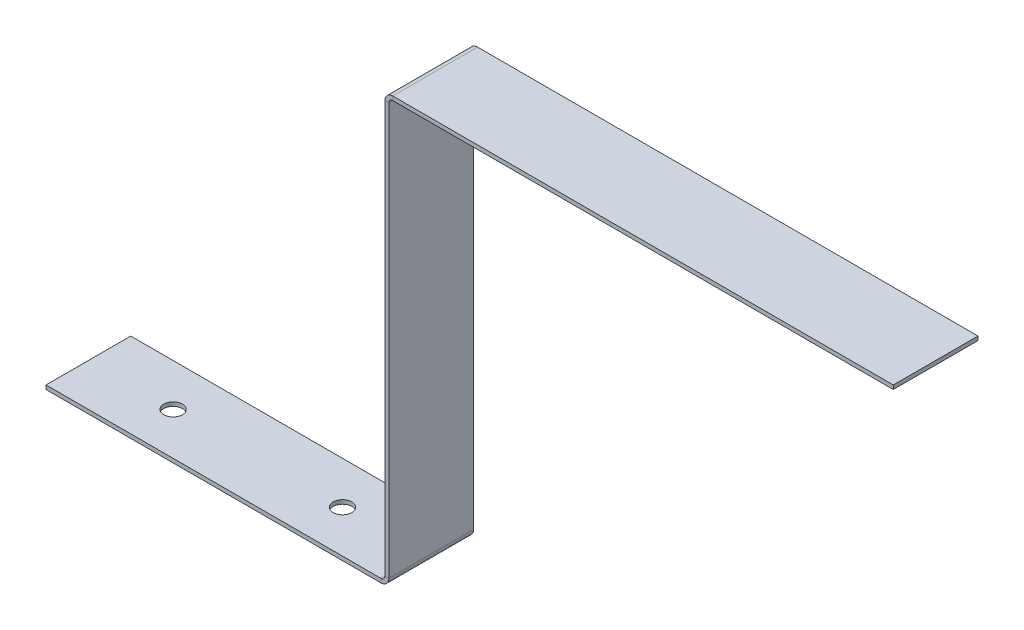
ISO-10303-21;
HEADER;
FILE_DESCRIPTION(('STEP AP214'),'2;1');
FILE_NAME('part.step','',(''),(''),'','','');
FILE_SCHEMA(('AUTOMOTIVE_DESIGN { 1 0 10303 214 1 1 1 1 }'));
ENDSEC;
DATA;
#1=APPLICATION_CONTEXT('core data for automotive mechanical design processes');
#2=APPLICATION_PROTOCOL_DEFINITION('international standard','automotive_design',2000,#1);
#3=PRODUCT_CONTEXT('',#1,'mechanical');
#4=PRODUCT('Part','Part','',(#3));
#5=PRODUCT_RELATED_PRODUCT_CATEGORY('part','',(#4));
#6=PRODUCT_DEFINITION_FORMATION('','',#4);
#7=PRODUCT_DEFINITION_CONTEXT('part definition',#1,'design');
#8=PRODUCT_DEFINITION('design','',#6,#7);
#9=PRODUCT_DEFINITION_SHAPE('','',#8);
#10=(LENGTH_UNIT() NAMED_UNIT(*) SI_UNIT(.MILLI.,.METRE.));
#11=(NAMED_UNIT(*) PLANE_ANGLE_UNIT() SI_UNIT($,.RADIAN.));
#12=(NAMED_UNIT(*) SI_UNIT($,.STERADIAN.) SOLID_ANGLE_UNIT());
#13=UNCERTAINTY_MEASURE_WITH_UNIT(LENGTH_MEASURE(1.E-05),#10,'distance_accuracy_value','');
#14=(GEOMETRIC_REPRESENTATION_CONTEXT(3) GLOBAL_UNCERTAINTY_ASSIGNED_CONTEXT((#13)) GLOBAL_UNIT_ASSIGNED_CONTEXT((#10,
#11,#12)) REPRESENTATION_CONTEXT('',''));
#15=CARTESIAN_POINT('',(0.,0.,0.));
#16=DIRECTION('',(0.,0.,1.));
#17=DIRECTION('',(1.,0.,0.));
#18=AXIS2_PLACEMENT_3D('',#15,#16,#17);
#19=CARTESIAN_POINT('',(60.,0.7,15.));
#20=DIRECTION('',(0.,0.,1.));
#21=DIRECTION('',(1.,0.,0.));
#22=AXIS2_PLACEMENT_3D('',#19,#20,#21);
#23=PLANE('',#22);
#24=DIRECTION('',(1.,0.,0.));
#25=VECTOR('',#24,1.);
#26=CARTESIAN_POINT('',(60.,0.7,15.));
#27=LINE('',#26,#25);
#28=CARTESIAN_POINT('',(60.,0.7,15.));
#29=VERTEX_POINT('',#28);
#30=CARTESIAN_POINT('',(60.7,0.7,15.));
#31=VERTEX_POINT('',#30);
#32=EDGE_CURVE('E11',#29,#31,#27,.T.);
#33=ORIENTED_EDGE('',*,*,#32,.F.);
#34=CARTESIAN_POINT('',(59.3,0.7,15.));
#35=DIRECTION('',(0.,0.,-1.));
#36=DIRECTION('',(-1.,0.,0.));
#37=AXIS2_PLACEMENT_3D('',#34,#35,#36);
#38=CIRCLE('',#37,0.7);
#39=CARTESIAN_POINT('',(59.3,0.,15.));
#40=VERTEX_POINT('',#39);
#41=EDGE_CURVE('E247',#40,#29,#38,.F.);
#42=ORIENTED_EDGE('',*,*,#41,.F.);
#43=DIRECTION('',(0.,1.,0.));
#44=VECTOR('',#43,1.);
#45=CARTESIAN_POINT('',(59.3,-0.7,15.));
#46=LINE('',#45,#44);
#47=CARTESIAN_POINT('',(59.3,-0.7,15.));
#48=VERTEX_POINT('',#47);
#49=EDGE_CURVE('E44',#48,#40,#46,.T.);
#50=ORIENTED_EDGE('',*,*,#49,.F.);
#51=CARTESIAN_POINT('',(59.3,0.7,15.));
#52=DIRECTION('',(0.,0.,1.));
#53=DIRECTION('',(1.,0.,0.));
#54=AXIS2_PLACEMENT_3D('',#51,#52,#53);
#55=CIRCLE('',#54,1.4);
#56=EDGE_CURVE('E145',#48,#31,#55,.T.);
#57=ORIENTED_EDGE('',*,*,#56,.T.);
#58=EDGE_LOOP('',(#33,#42,#50,#57));
#59=FACE_BOUND('',#58,.T.);
#60=ADVANCED_FACE('F36',(#59),#23,.T.);
#61=CARTESIAN_POINT('',(59.3,-0.7,15.));
#62=DIRECTION('',(0.,0.,1.));
#63=DIRECTION('',(1.,0.,0.));
#64=AXIS2_PLACEMENT_3D('',#61,#62,#63);
#65=PLANE('',#64);
#66=DIRECTION('',(0.,1.,0.));
#67=VECTOR('',#66,1.);
#68=CARTESIAN_POINT('',(60.,0.,15.));
#69=LINE('',#68,#67);
#70=CARTESIAN_POINT('',(60.,73.6,15.));
#71=VERTEX_POINT('',#70);
#72=EDGE_CURVE('E139',#29,#71,#69,.T.);
#73=ORIENTED_EDGE('',*,*,#72,.F.);
#74=ORIENTED_EDGE('',*,*,#32,.T.);
#75=DIRECTION('',(0.,1.,0.));
#76=VECTOR('',#75,1.);
#77=CARTESIAN_POINT('',(60.7,0.,15.));
#78=LINE('',#77,#76);
#79=CARTESIAN_POINT('',(60.7,73.6,15.));
#80=VERTEX_POINT('',#79);
#81=EDGE_CURVE('E136',#31,#80,#78,.T.);
#82=ORIENTED_EDGE('',*,*,#81,.T.);
#83=DIRECTION('',(-1.,0.,0.));
#84=VECTOR('',#83,1.);
#85=CARTESIAN_POINT('',(60.7,73.6,15.));
#86=LINE('',#85,#84);
#87=EDGE_CURVE('E228',#80,#71,#86,.T.);
#88=ORIENTED_EDGE('',*,*,#87,.T.);
#89=EDGE_LOOP('',(#73,#74,#82,#88));
#90=FACE_BOUND('',#89,.T.);
#91=ADVANCED_FACE('F134',(#90),#65,.T.);
#92=CARTESIAN_POINT('',(59.3,0.,0.));
#93=DIRECTION('',(0.,0.,-1.));
#94=DIRECTION('',(-1.,0.,0.));
#95=AXIS2_PLACEMENT_3D('',#92,#93,#94);
#96=PLANE('',#95);
#97=DIRECTION('',(0.,-1.,0.));
#98=VECTOR('',#97,1.);
#99=CARTESIAN_POINT('',(59.3,0.,0.));
#100=LINE('',#99,#98);
#101=CARTESIAN_POINT('',(59.3,0.,0.));
#102=VERTEX_POINT('',#101);
#103=CARTESIAN_POINT('',(59.3,-0.7,0.));
#104=VERTEX_POINT('',#103);
#105=EDGE_CURVE('E233',#102,#104,#100,.T.);
#106=ORIENTED_EDGE('',*,*,#105,.F.);
#107=CARTESIAN_POINT('',(59.3,0.7,0.));
#108=DIRECTION('',(0.,0.,-1.));
#109=DIRECTION('',(-1.,0.,0.));
#110=AXIS2_PLACEMENT_3D('',#107,#108,#109);
#111=CIRCLE('',#110,0.7);
#112=CARTESIAN_POINT('',(60.,0.7,0.));
#113=VERTEX_POINT('',#112);
#114=EDGE_CURVE('E185',#102,#113,#111,.F.);
#115=ORIENTED_EDGE('',*,*,#114,.T.);
#116=DIRECTION('',(-1.,0.,0.));
#117=VECTOR('',#116,1.);
#118=CARTESIAN_POINT('',(60.7,0.7,0.));
#119=LINE('',#118,#117);
#120=CARTESIAN_POINT('',(60.7,0.7,0.));
#121=VERTEX_POINT('',#120);
#122=EDGE_CURVE('E231',#121,#113,#119,.T.);
#123=ORIENTED_EDGE('',*,*,#122,.F.);
#124=CARTESIAN_POINT('',(59.3,0.7,0.));
#125=DIRECTION('',(0.,0.,1.));
#126=DIRECTION('',(1.,0.,0.));
#127=AXIS2_PLACEMENT_3D('',#124,#125,#126);
#128=CIRCLE('',#127,1.4);
#129=EDGE_CURVE('E157',#104,#121,#128,.T.);
#130=ORIENTED_EDGE('',*,*,#129,.F.);
#131=EDGE_LOOP('',(#106,#115,#123,#130));
#132=FACE_BOUND('',#131,.T.);
#133=ADVANCED_FACE('F305',(#132),#96,.T.);
#134=CARTESIAN_POINT('',(60.7,0.7,0.));
#135=DIRECTION('',(0.,0.,-1.));
#136=DIRECTION('',(-1.,0.,0.));
#137=AXIS2_PLACEMENT_3D('',#134,#135,#136);
#138=PLANE('',#137);
#139=DIRECTION('',(1.,0.,0.));
#140=VECTOR('',#139,1.);
#141=CARTESIAN_POINT('',(0.,0.,0.));
#142=LINE('',#141,#140);
#143=CARTESIAN_POINT('',(0.,0.,0.));
#144=VERTEX_POINT('',#143);
#145=EDGE_CURVE('E188',#144,#102,#142,.T.);
#146=ORIENTED_EDGE('',*,*,#145,.T.);
#147=ORIENTED_EDGE('',*,*,#105,.T.);
#148=DIRECTION('',(1.,0.,0.));
#149=VECTOR('',#148,1.);
#150=CARTESIAN_POINT('',(0.,-0.7,0.));
#151=LINE('',#150,#149);
#152=CARTESIAN_POINT('',(0.,-0.7,0.));
#153=VERTEX_POINT('',#152);
#154=EDGE_CURVE('E194',#153,#104,#151,.T.);
#155=ORIENTED_EDGE('',*,*,#154,.F.);
#156=DIRECTION('',(0.,1.,0.));
#157=VECTOR('',#156,1.);
#158=CARTESIAN_POINT('',(0.,-0.7,0.));
#159=LINE('',#158,#157);
#160=EDGE_CURVE('E191',#153,#144,#159,.T.);
#161=ORIENTED_EDGE('',*,*,#160,.T.);
#162=EDGE_LOOP('',(#146,#147,#155,#161));
#163=FACE_BOUND('',#162,.T.);
#164=ADVANCED_FACE('F309',(#163),#138,.T.);
#165=CARTESIAN_POINT('',(61.4,75.,15.));
#166=DIRECTION('',(0.,0.,1.));
#167=DIRECTION('',(1.,0.,0.));
#168=AXIS2_PLACEMENT_3D('',#165,#166,#167);
#169=PLANE('',#168);
#170=DIRECTION('',(0.,-1.,0.));
#171=VECTOR('',#170,1.);
#172=CARTESIAN_POINT('',(61.4,75.,15.));
#173=LINE('',#172,#171);
#174=CARTESIAN_POINT('',(61.4,75.,15.));
#175=VERTEX_POINT('',#174);
#176=CARTESIAN_POINT('',(61.4,74.3,15.));
#177=VERTEX_POINT('',#176);
#178=EDGE_CURVE('E52',#175,#177,#173,.T.);
#179=ORIENTED_EDGE('',*,*,#178,.F.);
#180=CARTESIAN_POINT('',(61.4,73.6,15.));
#181=DIRECTION('',(0.,0.,1.));
#182=DIRECTION('',(1.,0.,0.));
#183=AXIS2_PLACEMENT_3D('',#180,#181,#182);
#184=CIRCLE('',#183,1.4);
#185=EDGE_CURVE('E257',#71,#175,#184,.F.);
#186=ORIENTED_EDGE('',*,*,#185,.F.);
#187=ORIENTED_EDGE('',*,*,#87,.F.);
#188=CARTESIAN_POINT('',(61.4,73.6,15.));
#189=DIRECTION('',(0.,0.,1.));
#190=DIRECTION('',(1.,0.,0.));
#191=AXIS2_PLACEMENT_3D('',#188,#189,#190);
#192=CIRCLE('',#191,0.7);
#193=EDGE_CURVE('E165',#80,#177,#192,.F.);
#194=ORIENTED_EDGE('',*,*,#193,.T.);
#195=EDGE_LOOP('',(#179,#186,#187,#194));
#196=FACE_BOUND('',#195,.T.);
#197=ADVANCED_FACE('F315',(#196),#169,.T.);
#198=CARTESIAN_POINT('',(60.7,73.6,15.));
#199=DIRECTION('',(0.,0.,1.));
#200=DIRECTION('',(1.,0.,0.));
#201=AXIS2_PLACEMENT_3D('',#198,#199,#200);
#202=PLANE('',#201);
#203=DIRECTION('',(1.,0.,0.));
#204=VECTOR('',#203,1.);
#205=CARTESIAN_POINT('',(60.,75.,15.));
#206=LINE('',#205,#204);
#207=CARTESIAN_POINT('',(150.,75.,15.));
#208=VERTEX_POINT('',#207);
#209=EDGE_CURVE('E260',#175,#208,#206,.T.);
#210=ORIENTED_EDGE('',*,*,#209,.F.);
#211=ORIENTED_EDGE('',*,*,#178,.T.);
#212=DIRECTION('',(1.,0.,0.));
#213=VECTOR('',#212,1.);
#214=CARTESIAN_POINT('',(60.,74.3,15.));
#215=LINE('',#214,#213);
#216=CARTESIAN_POINT('',(150.,74.3,15.));
#217=VERTEX_POINT('',#216);
#218=EDGE_CURVE('E106',#177,#217,#215,.T.);
#219=ORIENTED_EDGE('',*,*,#218,.T.);
#220=DIRECTION('',(0.,-1.,0.));
#221=VECTOR('',#220,1.);
#222=CARTESIAN_POINT('',(150.,75.,15.));
#223=LINE('',#222,#221);
#224=EDGE_CURVE('E263',#208,#217,#223,.T.);
#225=ORIENTED_EDGE('',*,*,#224,.F.);
#226=EDGE_LOOP('',(#210,#211,#219,#225));
#227=FACE_BOUND('',#226,.T.);
#228=ADVANCED_FACE('F319',(#227),#202,.T.);
#229=CARTESIAN_POINT('',(60.,73.6,0.));
#230=DIRECTION('',(0.,0.,-1.));
#231=DIRECTION('',(-1.,0.,0.));
#232=AXIS2_PLACEMENT_3D('',#229,#230,#231);
#233=PLANE('',#232);
#234=DIRECTION('',(1.,0.,0.));
#235=VECTOR('',#234,1.);
#236=CARTESIAN_POINT('',(60.,73.6,0.));
#237=LINE('',#236,#235);
#238=CARTESIAN_POINT('',(60.,73.6,0.));
#239=VERTEX_POINT('',#238);
#240=CARTESIAN_POINT('',(60.7,73.6,0.));
#241=VERTEX_POINT('',#240);
#242=EDGE_CURVE('E93',#239,#241,#237,.T.);
#243=ORIENTED_EDGE('',*,*,#242,.F.);
#244=CARTESIAN_POINT('',(61.4,73.6,0.));
#245=DIRECTION('',(0.,0.,1.));
#246=DIRECTION('',(1.,0.,0.));
#247=AXIS2_PLACEMENT_3D('',#244,#245,#246);
#248=CIRCLE('',#247,1.4);
#249=CARTESIAN_POINT('',(61.4,75.,0.));
#250=VERTEX_POINT('',#249);
#251=EDGE_CURVE('E181',#239,#250,#248,.F.);
#252=ORIENTED_EDGE('',*,*,#251,.T.);
#253=DIRECTION('',(0.,1.,0.));
#254=VECTOR('',#253,1.);
#255=CARTESIAN_POINT('',(61.4,74.3,0.));
#256=LINE('',#255,#254);
#257=CARTESIAN_POINT('',(61.4,74.3,0.));
#258=VERTEX_POINT('',#257);
#259=EDGE_CURVE('E100',#258,#250,#256,.T.);
#260=ORIENTED_EDGE('',*,*,#259,.F.);
#261=CARTESIAN_POINT('',(61.4,73.6,0.));
#262=DIRECTION('',(0.,0.,1.));
#263=DIRECTION('',(1.,0.,0.));
#264=AXIS2_PLACEMENT_3D('',#261,#262,#263);
#265=CIRCLE('',#264,0.7);
#266=EDGE_CURVE('E200',#241,#258,#265,.F.);
#267=ORIENTED_EDGE('',*,*,#266,.F.);
#268=EDGE_LOOP('',(#243,#252,#260,#267));
#269=FACE_BOUND('',#268,.T.);
#270=ADVANCED_FACE('F323',(#269),#233,.T.);
#271=CARTESIAN_POINT('',(61.4,74.3,0.));
#272=DIRECTION('',(0.,0.,-1.));
#273=DIRECTION('',(-1.,0.,0.));
#274=AXIS2_PLACEMENT_3D('',#271,#272,#273);
#275=PLANE('',#274);
#276=DIRECTION('',(0.,1.,0.));
#277=VECTOR('',#276,1.);
#278=CARTESIAN_POINT('',(60.,0.,0.));
#279=LINE('',#278,#277);
#280=EDGE_CURVE('E183',#113,#239,#279,.T.);
#281=ORIENTED_EDGE('',*,*,#280,.T.);
#282=ORIENTED_EDGE('',*,*,#242,.T.);
#283=DIRECTION('',(0.,1.,0.));
#284=VECTOR('',#283,1.);
#285=CARTESIAN_POINT('',(60.7,0.,0.));
#286=LINE('',#285,#284);
#287=EDGE_CURVE('E198',#121,#241,#286,.T.);
#288=ORIENTED_EDGE('',*,*,#287,.F.);
#289=ORIENTED_EDGE('',*,*,#122,.T.);
#290=EDGE_LOOP('',(#281,#282,#288,#289));
#291=FACE_BOUND('',#290,.T.);
#292=ADVANCED_FACE('F326',(#291),#275,.T.);
#293=CARTESIAN_POINT('',(60.,74.3,15.));
#294=DIRECTION('',(0.,1.,0.));
#295=DIRECTION('',(0.,0.,1.));
#296=AXIS2_PLACEMENT_3D('',#293,#294,#295);
#297=PLANE('',#296);
#298=DIRECTION('',(1.,0.,0.));
#299=VECTOR('',#298,1.);
#300=CARTESIAN_POINT('',(60.,74.3,0.));
#301=LINE('',#300,#299);
#302=CARTESIAN_POINT('',(150.,74.3,0.));
#303=VERTEX_POINT('',#302);
#304=EDGE_CURVE('E171',#258,#303,#301,.T.);
#305=ORIENTED_EDGE('',*,*,#304,.T.);
#306=DIRECTION('',(0.,0.,-1.));
#307=VECTOR('',#306,1.);
#308=CARTESIAN_POINT('',(150.,74.3,15.));
#309=LINE('',#308,#307);
#310=EDGE_CURVE('E224',#217,#303,#309,.T.);
#311=ORIENTED_EDGE('',*,*,#310,.F.);
#312=ORIENTED_EDGE('',*,*,#218,.F.);
#313=DIRECTION('',(0.,0.,-1.));
#314=VECTOR('',#313,1.);
#315=CARTESIAN_POINT('',(61.4,74.3,15.));
#316=LINE('',#315,#314);
#317=EDGE_CURVE('E167',#177,#258,#316,.T.);
#318=ORIENTED_EDGE('',*,*,#317,.T.);
#319=EDGE_LOOP('',(#305,#311,#312,#318));
#320=FACE_BOUND('',#319,.T.);
#321=ADVANCED_FACE('F329',(#320),#297,.F.);
#322=CARTESIAN_POINT('',(150.,75.,15.));
#323=DIRECTION('',(1.,0.,0.));
#324=DIRECTION('',(0.,0.,-1.));
#325=AXIS2_PLACEMENT_3D('',#322,#323,#324);
#326=PLANE('',#325);
#327=DIRECTION('',(0.,-1.,0.));
#328=VECTOR('',#327,1.);
#329=CARTESIAN_POINT('',(150.,75.,0.));
#330=LINE('',#329,#328);
#331=CARTESIAN_POINT('',(150.,75.,0.));
#332=VERTEX_POINT('',#331);
#333=EDGE_CURVE('E174',#332,#303,#330,.T.);
#334=ORIENTED_EDGE('',*,*,#333,.F.);
#335=DIRECTION('',(0.,0.,-1.));
#336=VECTOR('',#335,1.);
#337=CARTESIAN_POINT('',(150.,75.,15.));
#338=LINE('',#337,#336);
#339=EDGE_CURVE('E222',#208,#332,#338,.T.);
#340=ORIENTED_EDGE('',*,*,#339,.F.);
#341=ORIENTED_EDGE('',*,*,#224,.T.);
#342=ORIENTED_EDGE('',*,*,#310,.T.);
#343=EDGE_LOOP('',(#334,#340,#341,#342));
#344=FACE_BOUND('',#343,.T.);
#345=ADVANCED_FACE('F332',(#344),#326,.T.);
#346=CARTESIAN_POINT('',(60.,75.,15.));
#347=DIRECTION('',(0.,1.,0.));
#348=DIRECTION('',(0.,0.,1.));
#349=AXIS2_PLACEMENT_3D('',#346,#347,#348);
#350=PLANE('',#349);
#351=DIRECTION('',(1.,0.,0.));
#352=VECTOR('',#351,1.);
#353=CARTESIAN_POINT('',(60.,75.,0.));
#354=LINE('',#353,#352);
#355=EDGE_CURVE('E178',#250,#332,#354,.T.);
#356=ORIENTED_EDGE('',*,*,#355,.F.);
#357=DIRECTION('',(0.,0.,-1.));
#358=VECTOR('',#357,1.);
#359=CARTESIAN_POINT('',(61.4,75.,15.));
#360=LINE('',#359,#358);
#361=EDGE_CURVE('E219',#175,#250,#360,.T.);
#362=ORIENTED_EDGE('',*,*,#361,.F.);
#363=ORIENTED_EDGE('',*,*,#209,.T.);
#364=ORIENTED_EDGE('',*,*,#339,.T.);
#365=EDGE_LOOP('',(#356,#362,#363,#364));
#366=FACE_BOUND('',#365,.T.);
#367=ADVANCED_FACE('F336',(#366),#350,.T.);
#368=CARTESIAN_POINT('',(61.4,73.6,15.));
#369=DIRECTION('',(0.,0.,-1.));
#370=DIRECTION('',(-1.,0.,0.));
#371=AXIS2_PLACEMENT_3D('',#368,#369,#370);
#372=CYLINDRICAL_SURFACE('',#371,1.4);
#373=ORIENTED_EDGE('',*,*,#251,.F.);
#374=DIRECTION('',(0.,0.,-1.));
#375=VECTOR('',#374,1.);
#376=CARTESIAN_POINT('',(60.,73.6,15.));
#377=LINE('',#376,#375);
#378=EDGE_CURVE('E216',#71,#239,#377,.T.);
#379=ORIENTED_EDGE('',*,*,#378,.F.);
#380=ORIENTED_EDGE('',*,*,#185,.T.);
#381=ORIENTED_EDGE('',*,*,#361,.T.);
#382=EDGE_LOOP('',(#373,#379,#380,#381));
#383=FACE_BOUND('',#382,.T.);
#384=ADVANCED_FACE('F340',(#383),#372,.T.);
#385=CARTESIAN_POINT('',(60.,0.,15.));
#386=DIRECTION('',(-1.,0.,0.));
#387=DIRECTION('',(0.,0.,1.));
#388=AXIS2_PLACEMENT_3D('',#385,#386,#387);
#389=PLANE('',#388);
#390=ORIENTED_EDGE('',*,*,#280,.F.);
#391=DIRECTION('',(0.,0.,-1.));
#392=VECTOR('',#391,1.);
#393=CARTESIAN_POINT('',(60.,0.7,15.));
#394=LINE('',#393,#392);
#395=EDGE_CURVE('E213',#29,#113,#394,.T.);
#396=ORIENTED_EDGE('',*,*,#395,.F.);
#397=ORIENTED_EDGE('',*,*,#72,.T.);
#398=ORIENTED_EDGE('',*,*,#378,.T.);
#399=EDGE_LOOP('',(#390,#396,#397,#398));
#400=FACE_BOUND('',#399,.T.);
#401=ADVANCED_FACE('F344',(#400),#389,.T.);
#402=CARTESIAN_POINT('',(59.3,0.7,15.));
#403=DIRECTION('',(0.,0.,-1.));
#404=DIRECTION('',(-1.,0.,0.));
#405=AXIS2_PLACEMENT_3D('',#402,#403,#404);
#406=CYLINDRICAL_SURFACE('',#405,0.7);
#407=ORIENTED_EDGE('',*,*,#114,.F.);
#408=DIRECTION('',(0.,0.,-1.));
#409=VECTOR('',#408,1.);
#410=CARTESIAN_POINT('',(59.3,0.,15.));
#411=LINE('',#410,#409);
#412=EDGE_CURVE('E210',#40,#102,#411,.T.);
#413=ORIENTED_EDGE('',*,*,#412,.F.);
#414=ORIENTED_EDGE('',*,*,#41,.T.);
#415=ORIENTED_EDGE('',*,*,#395,.T.);
#416=EDGE_LOOP('',(#407,#413,#414,#415));
#417=FACE_BOUND('',#416,.T.);
#418=ADVANCED_FACE('F246',(#417),#406,.F.);
#419=CARTESIAN_POINT('',(0.,0.,15.));
#420=DIRECTION('',(0.,1.,0.));
#421=DIRECTION('',(0.,0.,1.));
#422=AXIS2_PLACEMENT_3D('',#419,#420,#421);
#423=PLANE('',#422);
#424=CARTESIAN_POINT('',(15.,0.,7.5));
#425=DIRECTION('',(0.,1.,0.));
#426=DIRECTION('',(0.,0.,1.));
#427=AXIS2_PLACEMENT_3D('',#424,#425,#426);
#428=CIRCLE('',#427,1.64265795989006);
#429=CARTESIAN_POINT('',(15.,0.,9.14265795989006));
#430=VERTEX_POINT('',#429);
#431=EDGE_CURVE('E270',#430,#430,#428,.T.);
#432=ORIENTED_EDGE('',*,*,#431,.F.);
#433=EDGE_LOOP('',(#432));
#434=FACE_BOUND('',#433,.T.);
#435=CARTESIAN_POINT('',(45.,0.,7.5));
#436=DIRECTION('',(0.,1.,0.));
#437=DIRECTION('',(0.,0.,1.));
#438=AXIS2_PLACEMENT_3D('',#435,#436,#437);
#439=CIRCLE('',#438,1.64265795989005);
#440=CARTESIAN_POINT('',(45.,0.,9.14265795989005));
#441=VERTEX_POINT('',#440);
#442=EDGE_CURVE('E271',#441,#441,#439,.T.);
#443=ORIENTED_EDGE('',*,*,#442,.F.);
#444=EDGE_LOOP('',(#443));
#445=FACE_BOUND('',#444,.T.);
#446=ORIENTED_EDGE('',*,*,#145,.F.);
#447=DIRECTION('',(0.,0.,-1.));
#448=VECTOR('',#447,1.);
#449=CARTESIAN_POINT('',(0.,0.,15.));
#450=LINE('',#449,#448);
#451=CARTESIAN_POINT('',(0.,0.,15.));
#452=VERTEX_POINT('',#451);
#453=EDGE_CURVE('E208',#452,#144,#450,.T.);
#454=ORIENTED_EDGE('',*,*,#453,.F.);
#455=DIRECTION('',(1.,0.,0.));
#456=VECTOR('',#455,1.);
#457=CARTESIAN_POINT('',(0.,0.,15.));
#458=LINE('',#457,#456);
#459=EDGE_CURVE('E240',#452,#40,#458,.T.);
#460=ORIENTED_EDGE('',*,*,#459,.T.);
#461=ORIENTED_EDGE('',*,*,#412,.T.);
#462=EDGE_LOOP('',(#446,#454,#460,#461));
#463=FACE_BOUND('',#462,.T.);
#464=ADVANCED_FACE('F251',(#434,#445,#463),#423,.T.);
#465=CARTESIAN_POINT('',(0.,-0.7,15.));
#466=DIRECTION('',(-1.,0.,0.));
#467=DIRECTION('',(0.,0.,1.));
#468=AXIS2_PLACEMENT_3D('',#465,#466,#467);
#469=PLANE('',#468);
#470=ORIENTED_EDGE('',*,*,#160,.F.);
#471=DIRECTION('',(0.,0.,-1.));
#472=VECTOR('',#471,1.);
#473=CARTESIAN_POINT('',(0.,-0.7,15.));
#474=LINE('',#473,#472);
#475=CARTESIAN_POINT('',(0.,-0.7,15.));
#476=VERTEX_POINT('',#475);
#477=EDGE_CURVE('E206',#476,#153,#474,.T.);
#478=ORIENTED_EDGE('',*,*,#477,.F.);
#479=DIRECTION('',(0.,1.,0.));
#480=VECTOR('',#479,1.);
#481=CARTESIAN_POINT('',(0.,-0.7,15.));
#482=LINE('',#481,#480);
#483=EDGE_CURVE('E252',#476,#452,#482,.T.);
#484=ORIENTED_EDGE('',*,*,#483,.T.);
#485=ORIENTED_EDGE('',*,*,#453,.T.);
#486=EDGE_LOOP('',(#470,#478,#484,#485));
#487=FACE_BOUND('',#486,.T.);
#488=ADVANCED_FACE('F283',(#487),#469,.T.);
#489=CARTESIAN_POINT('',(0.,-0.7,15.));
#490=DIRECTION('',(0.,1.,0.));
#491=DIRECTION('',(0.,0.,1.));
#492=AXIS2_PLACEMENT_3D('',#489,#490,#491);
#493=PLANE('',#492);
#494=CARTESIAN_POINT('',(15.,-0.7,7.5));
#495=DIRECTION('',(0.,1.,0.));
#496=DIRECTION('',(0.,0.,1.));
#497=AXIS2_PLACEMENT_3D('',#494,#495,#496);
#498=CIRCLE('',#497,1.64265795989006);
#499=CARTESIAN_POINT('',(15.,-0.7,9.14265795989006));
#500=VERTEX_POINT('',#499);
#501=EDGE_CURVE('E175',#500,#500,#498,.F.);
#502=ORIENTED_EDGE('',*,*,#501,.F.);
#503=EDGE_LOOP('',(#502));
#504=FACE_BOUND('',#503,.T.);
#505=CARTESIAN_POINT('',(45.,-0.7,7.5));
#506=DIRECTION('',(0.,1.,0.));
#507=DIRECTION('',(0.,0.,1.));
#508=AXIS2_PLACEMENT_3D('',#505,#506,#507);
#509=CIRCLE('',#508,1.64265795989005);
#510=CARTESIAN_POINT('',(45.,-0.7,9.14265795989005));
#511=VERTEX_POINT('',#510);
#512=EDGE_CURVE('E267',#511,#511,#509,.F.);
#513=ORIENTED_EDGE('',*,*,#512,.F.);
#514=EDGE_LOOP('',(#513));
#515=FACE_BOUND('',#514,.T.);
#516=ORIENTED_EDGE('',*,*,#154,.T.);
#517=DIRECTION('',(0.,0.,-1.));
#518=VECTOR('',#517,1.);
#519=CARTESIAN_POINT('',(59.3,-0.7,15.));
#520=LINE('',#519,#518);
#521=EDGE_CURVE('E159',#48,#104,#520,.T.);
#522=ORIENTED_EDGE('',*,*,#521,.F.);
#523=DIRECTION('',(1.,0.,0.));
#524=VECTOR('',#523,1.);
#525=CARTESIAN_POINT('',(0.,-0.7,15.));
#526=LINE('',#525,#524);
#527=EDGE_CURVE('E150',#476,#48,#526,.T.);
#528=ORIENTED_EDGE('',*,*,#527,.F.);
#529=ORIENTED_EDGE('',*,*,#477,.T.);
#530=EDGE_LOOP('',(#516,#522,#528,#529));
#531=FACE_BOUND('',#530,.T.);
#532=ADVANCED_FACE('F353',(#504,#515,#531),#493,.F.);
#533=CARTESIAN_POINT('',(59.3,0.7,15.));
#534=DIRECTION('',(0.,0.,-1.));
#535=DIRECTION('',(-1.,0.,0.));
#536=AXIS2_PLACEMENT_3D('',#533,#534,#535);
#537=CYLINDRICAL_SURFACE('',#536,1.4);
#538=ORIENTED_EDGE('',*,*,#129,.T.);
#539=DIRECTION('',(0.,0.,-1.));
#540=VECTOR('',#539,1.);
#541=CARTESIAN_POINT('',(60.7,0.7,15.));
#542=LINE('',#541,#540);
#543=EDGE_CURVE('E154',#31,#121,#542,.T.);
#544=ORIENTED_EDGE('',*,*,#543,.F.);
#545=ORIENTED_EDGE('',*,*,#56,.F.);
#546=ORIENTED_EDGE('',*,*,#521,.T.);
#547=EDGE_LOOP('',(#538,#544,#545,#546));
#548=FACE_BOUND('',#547,.T.);
#549=ADVANCED_FACE('F155',(#548),#537,.T.);
#550=CARTESIAN_POINT('',(60.7,0.,15.));
#551=DIRECTION('',(-1.,0.,0.));
#552=DIRECTION('',(0.,0.,1.));
#553=AXIS2_PLACEMENT_3D('',#550,#551,#552);
#554=PLANE('',#553);
#555=ORIENTED_EDGE('',*,*,#287,.T.);
#556=DIRECTION('',(0.,0.,-1.));
#557=VECTOR('',#556,1.);
#558=CARTESIAN_POINT('',(60.7,73.6,15.));
#559=LINE('',#558,#557);
#560=EDGE_CURVE('E160',#80,#241,#559,.T.);
#561=ORIENTED_EDGE('',*,*,#560,.F.);
#562=ORIENTED_EDGE('',*,*,#81,.F.);
#563=ORIENTED_EDGE('',*,*,#543,.T.);
#564=EDGE_LOOP('',(#555,#561,#562,#563));
#565=FACE_BOUND('',#564,.T.);
#566=ADVANCED_FACE('F162',(#565),#554,.F.);
#567=CARTESIAN_POINT('',(61.4,73.6,15.));
#568=DIRECTION('',(0.,0.,-1.));
#569=DIRECTION('',(-1.,0.,0.));
#570=AXIS2_PLACEMENT_3D('',#567,#568,#569);
#571=CYLINDRICAL_SURFACE('',#570,0.7);
#572=ORIENTED_EDGE('',*,*,#266,.T.);
#573=ORIENTED_EDGE('',*,*,#317,.F.);
#574=ORIENTED_EDGE('',*,*,#193,.F.);
#575=ORIENTED_EDGE('',*,*,#560,.T.);
#576=EDGE_LOOP('',(#572,#573,#574,#575));
#577=FACE_BOUND('',#576,.T.);
#578=ADVANCED_FACE('F362',(#577),#571,.F.);
#579=CARTESIAN_POINT('',(61.4,73.6,15.));
#580=DIRECTION('',(0.,0.,1.));
#581=DIRECTION('',(1.,0.,0.));
#582=AXIS2_PLACEMENT_3D('',#579,#580,#581);
#583=PLANE('',#582);
#584=ORIENTED_EDGE('',*,*,#527,.T.);
#585=ORIENTED_EDGE('',*,*,#49,.T.);
#586=ORIENTED_EDGE('',*,*,#459,.F.);
#587=ORIENTED_EDGE('',*,*,#483,.F.);
#588=EDGE_LOOP('',(#584,#585,#586,#587));
#589=FACE_BOUND('',#588,.T.);
#590=ADVANCED_FACE('F237',(#589),#583,.T.);
#591=CARTESIAN_POINT('',(61.4,73.6,0.));
#592=DIRECTION('',(0.,0.,1.));
#593=DIRECTION('',(1.,0.,0.));
#594=AXIS2_PLACEMENT_3D('',#591,#592,#593);
#595=PLANE('',#594);
#596=ORIENTED_EDGE('',*,*,#304,.F.);
#597=ORIENTED_EDGE('',*,*,#259,.T.);
#598=ORIENTED_EDGE('',*,*,#355,.T.);
#599=ORIENTED_EDGE('',*,*,#333,.T.);
#600=EDGE_LOOP('',(#596,#597,#598,#599));
#601=FACE_BOUND('',#600,.T.);
#602=ADVANCED_FACE('F289',(#601),#595,.F.);
#603=CARTESIAN_POINT('',(45.,-5.34613833043327,7.5));
#604=DIRECTION('',(0.,1.,0.));
#605=DIRECTION('',(0.,0.,1.));
#606=AXIS2_PLACEMENT_3D('',#603,#604,#605);
#607=CYLINDRICAL_SURFACE('',#606,1.64265795989005);
#608=ORIENTED_EDGE('',*,*,#512,.T.);
#609=EDGE_LOOP('',(#608));
#610=FACE_BOUND('',#609,.T.);
#611=ORIENTED_EDGE('',*,*,#442,.T.);
#612=EDGE_LOOP('',(#611));
#613=FACE_BOUND('',#612,.T.);
#614=ADVANCED_FACE('F287',(#610,#613),#607,.F.);
#615=CARTESIAN_POINT('',(15.,-5.34613833043327,7.5));
#616=DIRECTION('',(0.,1.,0.));
#617=DIRECTION('',(0.,0.,1.));
#618=AXIS2_PLACEMENT_3D('',#615,#616,#617);
#619=CYLINDRICAL_SURFACE('',#618,1.64265795989006);
#620=ORIENTED_EDGE('',*,*,#501,.T.);
#621=EDGE_LOOP('',(#620));
#622=FACE_BOUND('',#621,.T.);
#623=ORIENTED_EDGE('',*,*,#431,.T.);
#624=EDGE_LOOP('',(#623));
#625=FACE_BOUND('',#624,.T.);
#626=ADVANCED_FACE('F279',(#622,#625),#619,.F.);
#627=CLOSED_SHELL('',(#60,#91,#133,#164,#197,#228,#270,#292,#321,#345,#367,#384,#401,#418,#464,
#488,#532,#549,#566,#578,#590,#602,#614,#626));
#628=MANIFOLD_SOLID_BREP('B2',#627);
#629=ADVANCED_BREP_SHAPE_REPRESENTATION('',(#18,#628),#14);
#630=SHAPE_DEFINITION_REPRESENTATION(#9,#629);
ENDSEC;
END-ISO-10303-21;
